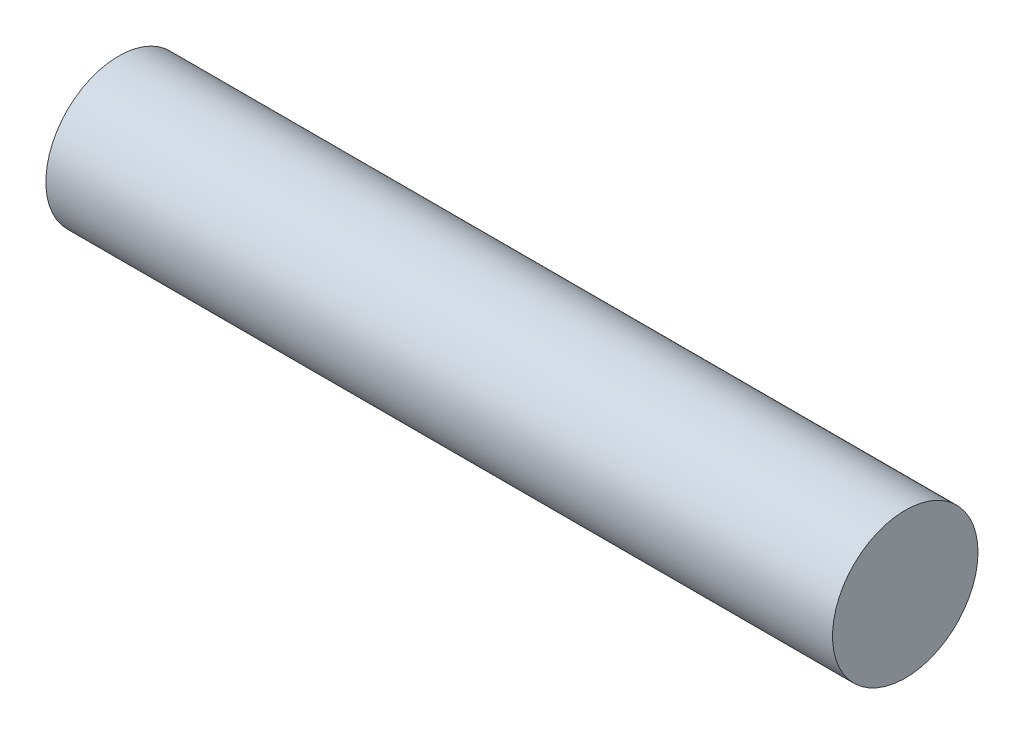
ISO-10303-21;
HEADER;
FILE_DESCRIPTION(('STEP AP214'),'2;1');
FILE_NAME('part.step','',(''),(''),'','','');
FILE_SCHEMA(('AUTOMOTIVE_DESIGN { 1 0 10303 214 1 1 1 1 }'));
ENDSEC;
DATA;
#1=APPLICATION_CONTEXT('core data for automotive mechanical design processes');
#2=APPLICATION_PROTOCOL_DEFINITION('international standard','automotive_design',2000,#1);
#3=PRODUCT_CONTEXT('',#1,'mechanical');
#4=PRODUCT('Part','Part','',(#3));
#5=PRODUCT_RELATED_PRODUCT_CATEGORY('part','',(#4));
#6=PRODUCT_DEFINITION_FORMATION('','',#4);
#7=PRODUCT_DEFINITION_CONTEXT('part definition',#1,'design');
#8=PRODUCT_DEFINITION('design','',#6,#7);
#9=PRODUCT_DEFINITION_SHAPE('','',#8);
#10=(LENGTH_UNIT() NAMED_UNIT(*) SI_UNIT(.MILLI.,.METRE.));
#11=(NAMED_UNIT(*) PLANE_ANGLE_UNIT() SI_UNIT($,.RADIAN.));
#12=(NAMED_UNIT(*) SI_UNIT($,.STERADIAN.) SOLID_ANGLE_UNIT());
#13=UNCERTAINTY_MEASURE_WITH_UNIT(LENGTH_MEASURE(1.E-05),#10,'distance_accuracy_value','');
#14=(GEOMETRIC_REPRESENTATION_CONTEXT(3) GLOBAL_UNCERTAINTY_ASSIGNED_CONTEXT((#13)) GLOBAL_UNIT_ASSIGNED_CONTEXT((#10,
#11,#12)) REPRESENTATION_CONTEXT('',''));
#15=CARTESIAN_POINT('',(0.,0.,0.));
#16=DIRECTION('',(0.,0.,1.));
#17=DIRECTION('',(1.,0.,0.));
#18=AXIS2_PLACEMENT_3D('',#15,#16,#17);
#19=CARTESIAN_POINT('',(0.,0.,0.));
#20=DIRECTION('',(-1.,0.,0.));
#21=DIRECTION('',(0.,0.,1.));
#22=AXIS2_PLACEMENT_3D('',#19,#20,#21);
#23=PLANE('',#22);
#24=CARTESIAN_POINT('',(0.,0.,0.));
#25=DIRECTION('',(1.,0.,0.));
#26=DIRECTION('',(0.,0.,-1.));
#27=AXIS2_PLACEMENT_3D('',#24,#25,#26);
#28=CIRCLE('',#27,6.74999999999999);
#29=CARTESIAN_POINT('',(0.,0.,-6.74999999999999));
#30=VERTEX_POINT('',#29);
#31=EDGE_CURVE('E10',#30,#30,#28,.T.);
#32=ORIENTED_EDGE('',*,*,#31,.F.);
#33=EDGE_LOOP('',(#32));
#34=FACE_BOUND('',#33,.T.);
#35=ADVANCED_FACE('F30',(#34),#23,.T.);
#36=CARTESIAN_POINT('',(78.2233077800797,0.,0.));
#37=DIRECTION('',(1.,0.,0.));
#38=DIRECTION('',(0.,0.,-1.));
#39=AXIS2_PLACEMENT_3D('',#36,#37,#38);
#40=CYLINDRICAL_SURFACE('',#39,6.74999999999999);
#41=ORIENTED_EDGE('',*,*,#31,.T.);
#42=EDGE_LOOP('',(#41));
#43=FACE_BOUND('',#42,.T.);
#44=CARTESIAN_POINT('',(73.,0.,0.));
#45=DIRECTION('',(1.,0.,0.));
#46=DIRECTION('',(0.,0.,-1.));
#47=AXIS2_PLACEMENT_3D('',#44,#45,#46);
#48=CIRCLE('',#47,6.74999999999999);
#49=CARTESIAN_POINT('',(73.,0.,-6.74999999999999));
#50=VERTEX_POINT('',#49);
#51=EDGE_CURVE('E36',#50,#50,#48,.T.);
#52=ORIENTED_EDGE('',*,*,#51,.F.);
#53=EDGE_LOOP('',(#52));
#54=FACE_BOUND('',#53,.T.);
#55=ADVANCED_FACE('F44',(#43,#54),#40,.T.);
#56=CARTESIAN_POINT('',(73.,6.74999999999999,0.));
#57=DIRECTION('',(1.,0.,0.));
#58=DIRECTION('',(0.,0.,-1.));
#59=AXIS2_PLACEMENT_3D('',#56,#57,#58);
#60=PLANE('',#59);
#61=ORIENTED_EDGE('',*,*,#51,.T.);
#62=EDGE_LOOP('',(#61));
#63=FACE_BOUND('',#62,.T.);
#64=ADVANCED_FACE('F42',(#63),#60,.T.);
#65=CLOSED_SHELL('',(#35,#55,#64));
#66=MANIFOLD_SOLID_BREP('B2',#65);
#67=ADVANCED_BREP_SHAPE_REPRESENTATION('',(#18,#66),#14);
#68=SHAPE_DEFINITION_REPRESENTATION(#9,#67);
ENDSEC;
END-ISO-10303-21;
